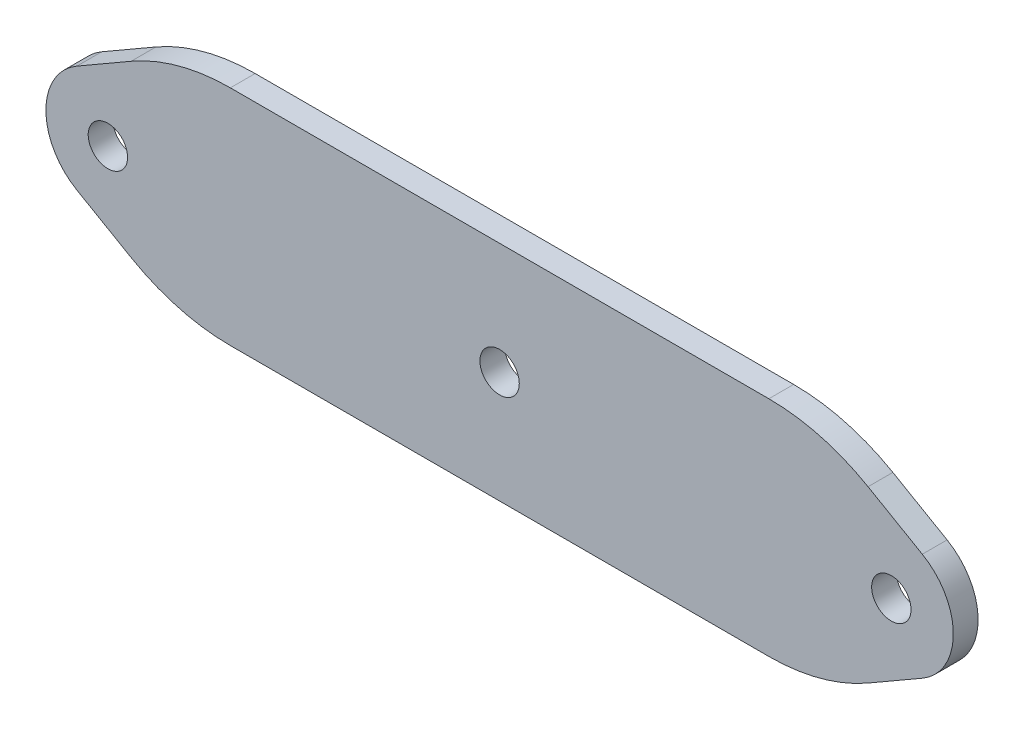
ISO-10303-21;
HEADER;
FILE_DESCRIPTION(('STEP AP214'),'2;1');
FILE_NAME('part.step','',(''),(''),'','','');
FILE_SCHEMA(('AUTOMOTIVE_DESIGN { 1 0 10303 214 1 1 1 1 }'));
ENDSEC;
DATA;
#1=APPLICATION_CONTEXT('core data for automotive mechanical design processes');
#2=APPLICATION_PROTOCOL_DEFINITION('international standard','automotive_design',2000,#1);
#3=PRODUCT_CONTEXT('',#1,'mechanical');
#4=PRODUCT('Part','Part','',(#3));
#5=PRODUCT_RELATED_PRODUCT_CATEGORY('part','',(#4));
#6=PRODUCT_DEFINITION_FORMATION('','',#4);
#7=PRODUCT_DEFINITION_CONTEXT('part definition',#1,'design');
#8=PRODUCT_DEFINITION('design','',#6,#7);
#9=PRODUCT_DEFINITION_SHAPE('','',#8);
#10=(LENGTH_UNIT() NAMED_UNIT(*) SI_UNIT(.MILLI.,.METRE.));
#11=(NAMED_UNIT(*) PLANE_ANGLE_UNIT() SI_UNIT($,.RADIAN.));
#12=(NAMED_UNIT(*) SI_UNIT($,.STERADIAN.) SOLID_ANGLE_UNIT());
#13=UNCERTAINTY_MEASURE_WITH_UNIT(LENGTH_MEASURE(1.E-05),#10,'distance_accuracy_value','');
#14=(GEOMETRIC_REPRESENTATION_CONTEXT(3) GLOBAL_UNCERTAINTY_ASSIGNED_CONTEXT((#13)) GLOBAL_UNIT_ASSIGNED_CONTEXT((#10,
#11,#12)) REPRESENTATION_CONTEXT('',''));
#15=CARTESIAN_POINT('',(0.,0.,0.));
#16=DIRECTION('',(0.,0.,1.));
#17=DIRECTION('',(1.,0.,0.));
#18=AXIS2_PLACEMENT_3D('',#15,#16,#17);
#19=CARTESIAN_POINT('',(78.9711431702999,0.,5.));
#20=DIRECTION('',(0.,0.,1.));
#21=DIRECTION('',(1.,0.,0.));
#22=AXIS2_PLACEMENT_3D('',#19,#20,#21);
#23=PLANE('',#22);
#24=CARTESIAN_POINT('',(78.9711431702999,0.,5.));
#25=DIRECTION('',(0.,0.,1.));
#26=DIRECTION('',(1.,0.,0.));
#27=AXIS2_PLACEMENT_3D('',#24,#25,#26);
#28=CIRCLE('',#27,3.96875);
#29=CARTESIAN_POINT('',(82.9398931702999,0.,5.));
#30=VERTEX_POINT('',#29);
#31=EDGE_CURVE('E333',#30,#30,#28,.T.);
#32=ORIENTED_EDGE('',*,*,#31,.F.);
#33=EDGE_LOOP('',(#32));
#34=FACE_BOUND('',#33,.T.);
#35=CARTESIAN_POINT('',(78.9711431702999,0.,5.));
#36=DIRECTION('',(0.,0.,1.));
#37=DIRECTION('',(1.,0.,0.));
#38=AXIS2_PLACEMENT_3D('',#35,#36,#37);
#39=CIRCLE('',#38,12.5);
#40=CARTESIAN_POINT('',(85.2211431702997,-10.8253175473056,5.));
#41=VERTEX_POINT('',#40);
#42=CARTESIAN_POINT('',(85.2211431702997,10.8253175473056,5.));
#43=VERTEX_POINT('',#42);
#44=EDGE_CURVE('E206',#41,#43,#39,.T.);
#45=ORIENTED_EDGE('',*,*,#44,.T.);
#46=DIRECTION('',(-0.86602540378444,0.499999999999998,0.));
#47=VECTOR('',#46,1.);
#48=CARTESIAN_POINT('',(74.2820323027552,17.1410161513775,5.));
#49=LINE('',#48,#47);
#50=CARTESIAN_POINT('',(74.2820323027552,17.1410161513775,5.));
#51=VERTEX_POINT('',#50);
#52=EDGE_CURVE('E118',#43,#51,#49,.T.);
#53=ORIENTED_EDGE('',*,*,#52,.T.);
#54=CARTESIAN_POINT('',(54.2820323027552,-17.5,5.));
#55=DIRECTION('',(0.,0.,1.));
#56=DIRECTION('',(-1.,0.,0.));
#57=AXIS2_PLACEMENT_3D('',#54,#55,#56);
#58=CIRCLE('',#57,40.);
#59=CARTESIAN_POINT('',(54.282032302755,22.5,5.));
#60=VERTEX_POINT('',#59);
#61=EDGE_CURVE('E243',#51,#60,#58,.T.);
#62=ORIENTED_EDGE('',*,*,#61,.T.);
#63=DIRECTION('',(-1.,0.,0.));
#64=VECTOR('',#63,1.);
#65=CARTESIAN_POINT('',(-54.282032302755,22.5,5.));
#66=LINE('',#65,#64);
#67=CARTESIAN_POINT('',(-54.282032302755,22.5,5.));
#68=VERTEX_POINT('',#67);
#69=EDGE_CURVE('E263',#60,#68,#66,.T.);
#70=ORIENTED_EDGE('',*,*,#69,.T.);
#71=CARTESIAN_POINT('',(-54.282032302755,-17.5,5.));
#72=DIRECTION('',(0.,0.,1.));
#73=DIRECTION('',(-1.,0.,0.));
#74=AXIS2_PLACEMENT_3D('',#71,#72,#73);
#75=CIRCLE('',#74,40.);
#76=CARTESIAN_POINT('',(-74.2820323027551,17.1410161513775,5.));
#77=VERTEX_POINT('',#76);
#78=EDGE_CURVE('E259',#68,#77,#75,.T.);
#79=ORIENTED_EDGE('',*,*,#78,.T.);
#80=DIRECTION('',(-0.866025403784437,-0.500000000000002,0.));
#81=VECTOR('',#80,1.);
#82=CARTESIAN_POINT('',(-85.2211431702997,10.8253175473055,5.));
#83=LINE('',#82,#81);
#84=CARTESIAN_POINT('',(-85.2211431702997,10.8253175473055,5.));
#85=VERTEX_POINT('',#84);
#86=EDGE_CURVE('E262',#77,#85,#83,.T.);
#87=ORIENTED_EDGE('',*,*,#86,.T.);
#88=CARTESIAN_POINT('',(-78.9711431702996,0.,5.));
#89=DIRECTION('',(0.,0.,1.));
#90=DIRECTION('',(-1.,0.,0.));
#91=AXIS2_PLACEMENT_3D('',#88,#89,#90);
#92=CIRCLE('',#91,12.5);
#93=CARTESIAN_POINT('',(-85.2211431702997,-10.8253175473055,5.));
#94=VERTEX_POINT('',#93);
#95=EDGE_CURVE('E267',#85,#94,#92,.T.);
#96=ORIENTED_EDGE('',*,*,#95,.T.);
#97=DIRECTION('',(0.866025403784438,-0.5,0.));
#98=VECTOR('',#97,1.);
#99=CARTESIAN_POINT('',(-74.2820323027551,-17.1410161513775,5.));
#100=LINE('',#99,#98);
#101=CARTESIAN_POINT('',(-74.2820323027551,-17.1410161513775,5.));
#102=VERTEX_POINT('',#101);
#103=EDGE_CURVE('E274',#94,#102,#100,.T.);
#104=ORIENTED_EDGE('',*,*,#103,.T.);
#105=CARTESIAN_POINT('',(-54.282032302755,17.5,5.));
#106=DIRECTION('',(0.,0.,1.));
#107=DIRECTION('',(-1.,0.,0.));
#108=AXIS2_PLACEMENT_3D('',#105,#106,#107);
#109=CIRCLE('',#108,40.);
#110=CARTESIAN_POINT('',(-54.2820323027551,-22.5,5.));
#111=VERTEX_POINT('',#110);
#112=EDGE_CURVE('E149',#102,#111,#109,.T.);
#113=ORIENTED_EDGE('',*,*,#112,.T.);
#114=DIRECTION('',(1.,0.,0.));
#115=VECTOR('',#114,1.);
#116=CARTESIAN_POINT('',(54.282032302755,-22.5,5.));
#117=LINE('',#116,#115);
#118=CARTESIAN_POINT('',(54.282032302755,-22.5,5.));
#119=VERTEX_POINT('',#118);
#120=EDGE_CURVE('E143',#111,#119,#117,.T.);
#121=ORIENTED_EDGE('',*,*,#120,.T.);
#122=CARTESIAN_POINT('',(54.2820323027552,17.5,5.));
#123=DIRECTION('',(0.,0.,1.));
#124=DIRECTION('',(1.,0.,0.));
#125=AXIS2_PLACEMENT_3D('',#122,#123,#124);
#126=CIRCLE('',#125,40.);
#127=CARTESIAN_POINT('',(74.2820323027552,-17.1410161513775,5.));
#128=VERTEX_POINT('',#127);
#129=EDGE_CURVE('E147',#119,#128,#126,.T.);
#130=ORIENTED_EDGE('',*,*,#129,.T.);
#131=DIRECTION('',(0.86602540378444,0.499999999999998,0.));
#132=VECTOR('',#131,1.);
#133=CARTESIAN_POINT('',(85.2211431702997,-10.8253175473056,5.));
#134=LINE('',#133,#132);
#135=EDGE_CURVE('E63',#128,#41,#134,.T.);
#136=ORIENTED_EDGE('',*,*,#135,.T.);
#137=EDGE_LOOP('',(#45,#53,#62,#70,#79,#87,#96,#104,#113,#121,#130,#136));
#138=FACE_BOUND('',#137,.T.);
#139=CARTESIAN_POINT('',(-78.9711431702996,0.,5.));
#140=DIRECTION('',(0.,0.,1.));
#141=DIRECTION('',(1.,0.,0.));
#142=AXIS2_PLACEMENT_3D('',#139,#140,#141);
#143=CIRCLE('',#142,3.96875);
#144=CARTESIAN_POINT('',(-75.0023931702996,0.,5.));
#145=VERTEX_POINT('',#144);
#146=EDGE_CURVE('E176',#145,#145,#143,.T.);
#147=ORIENTED_EDGE('',*,*,#146,.F.);
#148=EDGE_LOOP('',(#147));
#149=FACE_BOUND('',#148,.T.);
#150=CARTESIAN_POINT('',(0.,0.,5.));
#151=DIRECTION('',(0.,0.,1.));
#152=DIRECTION('',(1.,0.,0.));
#153=AXIS2_PLACEMENT_3D('',#150,#151,#152);
#154=CIRCLE('',#153,3.96875);
#155=CARTESIAN_POINT('',(3.96875,0.,5.));
#156=VERTEX_POINT('',#155);
#157=EDGE_CURVE('E322',#156,#156,#154,.T.);
#158=ORIENTED_EDGE('',*,*,#157,.F.);
#159=EDGE_LOOP('',(#158));
#160=FACE_BOUND('',#159,.T.);
#161=ADVANCED_FACE('F45',(#34,#138,#149,#160),#23,.T.);
#162=CARTESIAN_POINT('',(78.9711431702999,0.,0.));
#163=DIRECTION('',(0.,0.,1.));
#164=DIRECTION('',(1.,0.,0.));
#165=AXIS2_PLACEMENT_3D('',#162,#163,#164);
#166=PLANE('',#165);
#167=CARTESIAN_POINT('',(78.9711431702999,0.,0.));
#168=DIRECTION('',(0.,0.,1.));
#169=DIRECTION('',(1.,0.,0.));
#170=AXIS2_PLACEMENT_3D('',#167,#168,#169);
#171=CIRCLE('',#170,12.5);
#172=CARTESIAN_POINT('',(85.2211431702997,-10.8253175473056,0.));
#173=VERTEX_POINT('',#172);
#174=CARTESIAN_POINT('',(85.2211431702997,10.8253175473056,0.));
#175=VERTEX_POINT('',#174);
#176=EDGE_CURVE('E171',#173,#175,#171,.T.);
#177=ORIENTED_EDGE('',*,*,#176,.F.);
#178=DIRECTION('',(0.86602540378444,0.499999999999998,0.));
#179=VECTOR('',#178,1.);
#180=CARTESIAN_POINT('',(85.2211431702997,-10.8253175473056,0.));
#181=LINE('',#180,#179);
#182=CARTESIAN_POINT('',(74.2820323027552,-17.1410161513775,0.));
#183=VERTEX_POINT('',#182);
#184=EDGE_CURVE('E110',#183,#173,#181,.T.);
#185=ORIENTED_EDGE('',*,*,#184,.F.);
#186=CARTESIAN_POINT('',(54.2820323027552,17.5,0.));
#187=DIRECTION('',(0.,0.,1.));
#188=DIRECTION('',(1.,0.,0.));
#189=AXIS2_PLACEMENT_3D('',#186,#187,#188);
#190=CIRCLE('',#189,40.);
#191=CARTESIAN_POINT('',(54.282032302755,-22.5,0.));
#192=VERTEX_POINT('',#191);
#193=EDGE_CURVE('E104',#192,#183,#190,.T.);
#194=ORIENTED_EDGE('',*,*,#193,.F.);
#195=DIRECTION('',(1.,0.,0.));
#196=VECTOR('',#195,1.);
#197=CARTESIAN_POINT('',(54.282032302755,-22.5,0.));
#198=LINE('',#197,#196);
#199=CARTESIAN_POINT('',(-54.2820323027551,-22.5,0.));
#200=VERTEX_POINT('',#199);
#201=EDGE_CURVE('E158',#200,#192,#198,.T.);
#202=ORIENTED_EDGE('',*,*,#201,.F.);
#203=CARTESIAN_POINT('',(-54.282032302755,17.5,0.));
#204=DIRECTION('',(0.,0.,1.));
#205=DIRECTION('',(-1.,0.,0.));
#206=AXIS2_PLACEMENT_3D('',#203,#204,#205);
#207=CIRCLE('',#206,40.);
#208=CARTESIAN_POINT('',(-74.2820323027551,-17.1410161513775,0.));
#209=VERTEX_POINT('',#208);
#210=EDGE_CURVE('E197',#209,#200,#207,.T.);
#211=ORIENTED_EDGE('',*,*,#210,.F.);
#212=DIRECTION('',(0.866025403784438,-0.5,0.));
#213=VECTOR('',#212,1.);
#214=CARTESIAN_POINT('',(-74.2820323027551,-17.1410161513775,0.));
#215=LINE('',#214,#213);
#216=CARTESIAN_POINT('',(-85.2211431702997,-10.8253175473055,0.));
#217=VERTEX_POINT('',#216);
#218=EDGE_CURVE('E194',#217,#209,#215,.T.);
#219=ORIENTED_EDGE('',*,*,#218,.F.);
#220=CARTESIAN_POINT('',(-78.9711431702996,0.,0.));
#221=DIRECTION('',(0.,0.,1.));
#222=DIRECTION('',(-1.,0.,0.));
#223=AXIS2_PLACEMENT_3D('',#220,#221,#222);
#224=CIRCLE('',#223,12.5);
#225=CARTESIAN_POINT('',(-85.2211431702997,10.8253175473055,0.));
#226=VERTEX_POINT('',#225);
#227=EDGE_CURVE('E191',#226,#217,#224,.T.);
#228=ORIENTED_EDGE('',*,*,#227,.F.);
#229=DIRECTION('',(-0.866025403784437,-0.500000000000002,0.));
#230=VECTOR('',#229,1.);
#231=CARTESIAN_POINT('',(-85.2211431702997,10.8253175473055,0.));
#232=LINE('',#231,#230);
#233=CARTESIAN_POINT('',(-74.2820323027551,17.1410161513775,0.));
#234=VERTEX_POINT('',#233);
#235=EDGE_CURVE('E188',#234,#226,#232,.T.);
#236=ORIENTED_EDGE('',*,*,#235,.F.);
#237=CARTESIAN_POINT('',(-54.282032302755,-17.5,0.));
#238=DIRECTION('',(0.,0.,1.));
#239=DIRECTION('',(-1.,0.,0.));
#240=AXIS2_PLACEMENT_3D('',#237,#238,#239);
#241=CIRCLE('',#240,40.);
#242=CARTESIAN_POINT('',(-54.282032302755,22.5,0.));
#243=VERTEX_POINT('',#242);
#244=EDGE_CURVE('E185',#243,#234,#241,.T.);
#245=ORIENTED_EDGE('',*,*,#244,.F.);
#246=DIRECTION('',(-1.,0.,0.));
#247=VECTOR('',#246,1.);
#248=CARTESIAN_POINT('',(-54.282032302755,22.5,0.));
#249=LINE('',#248,#247);
#250=CARTESIAN_POINT('',(54.282032302755,22.5,0.));
#251=VERTEX_POINT('',#250);
#252=EDGE_CURVE('E182',#251,#243,#249,.T.);
#253=ORIENTED_EDGE('',*,*,#252,.F.);
#254=CARTESIAN_POINT('',(54.2820323027552,-17.5,0.));
#255=DIRECTION('',(0.,0.,1.));
#256=DIRECTION('',(-1.,0.,0.));
#257=AXIS2_PLACEMENT_3D('',#254,#255,#256);
#258=CIRCLE('',#257,40.);
#259=CARTESIAN_POINT('',(74.2820323027552,17.1410161513775,0.));
#260=VERTEX_POINT('',#259);
#261=EDGE_CURVE('E179',#260,#251,#258,.T.);
#262=ORIENTED_EDGE('',*,*,#261,.F.);
#263=DIRECTION('',(-0.86602540378444,0.499999999999998,0.));
#264=VECTOR('',#263,1.);
#265=CARTESIAN_POINT('',(74.2820323027552,17.1410161513775,0.));
#266=LINE('',#265,#264);
#267=EDGE_CURVE('E175',#175,#260,#266,.T.);
#268=ORIENTED_EDGE('',*,*,#267,.F.);
#269=EDGE_LOOP('',(#177,#185,#194,#202,#211,#219,#228,#236,#245,#253,#262,#268));
#270=FACE_BOUND('',#269,.T.);
#271=CARTESIAN_POINT('',(-78.9711431702996,0.,0.));
#272=DIRECTION('',(0.,0.,1.));
#273=DIRECTION('',(1.,0.,0.));
#274=AXIS2_PLACEMENT_3D('',#271,#272,#273);
#275=CIRCLE('',#274,3.96875);
#276=CARTESIAN_POINT('',(-75.0023931702996,0.,0.));
#277=VERTEX_POINT('',#276);
#278=EDGE_CURVE('E337',#277,#277,#275,.T.);
#279=ORIENTED_EDGE('',*,*,#278,.T.);
#280=EDGE_LOOP('',(#279));
#281=FACE_BOUND('',#280,.T.);
#282=CARTESIAN_POINT('',(78.9711431702999,0.,0.));
#283=DIRECTION('',(0.,0.,1.));
#284=DIRECTION('',(1.,0.,0.));
#285=AXIS2_PLACEMENT_3D('',#282,#283,#284);
#286=CIRCLE('',#285,3.96875);
#287=CARTESIAN_POINT('',(82.9398931702999,0.,0.));
#288=VERTEX_POINT('',#287);
#289=EDGE_CURVE('E330',#288,#288,#286,.T.);
#290=ORIENTED_EDGE('',*,*,#289,.T.);
#291=EDGE_LOOP('',(#290));
#292=FACE_BOUND('',#291,.T.);
#293=CARTESIAN_POINT('',(0.,0.,0.));
#294=DIRECTION('',(0.,0.,1.));
#295=DIRECTION('',(1.,0.,0.));
#296=AXIS2_PLACEMENT_3D('',#293,#294,#295);
#297=CIRCLE('',#296,3.96875);
#298=CARTESIAN_POINT('',(3.96875,0.,0.));
#299=VERTEX_POINT('',#298);
#300=EDGE_CURVE('E325',#299,#299,#297,.T.);
#301=ORIENTED_EDGE('',*,*,#300,.T.);
#302=EDGE_LOOP('',(#301));
#303=FACE_BOUND('',#302,.T.);
#304=ADVANCED_FACE('F247',(#270,#281,#292,#303),#166,.F.);
#305=CARTESIAN_POINT('',(78.9711431702999,0.,5.));
#306=DIRECTION('',(0.,0.,-1.));
#307=DIRECTION('',(-1.,0.,0.));
#308=AXIS2_PLACEMENT_3D('',#305,#306,#307);
#309=CYLINDRICAL_SURFACE('',#308,12.5);
#310=ORIENTED_EDGE('',*,*,#176,.T.);
#311=DIRECTION('',(0.,0.,-1.));
#312=VECTOR('',#311,1.);
#313=CARTESIAN_POINT('',(85.2211431702997,10.8253175473056,5.));
#314=LINE('',#313,#312);
#315=EDGE_CURVE('E11',#43,#175,#314,.T.);
#316=ORIENTED_EDGE('',*,*,#315,.F.);
#317=ORIENTED_EDGE('',*,*,#44,.F.);
#318=DIRECTION('',(0.,0.,-1.));
#319=VECTOR('',#318,1.);
#320=CARTESIAN_POINT('',(85.2211431702997,-10.8253175473056,5.));
#321=LINE('',#320,#319);
#322=EDGE_CURVE('E167',#41,#173,#321,.T.);
#323=ORIENTED_EDGE('',*,*,#322,.T.);
#324=EDGE_LOOP('',(#310,#316,#317,#323));
#325=FACE_BOUND('',#324,.T.);
#326=ADVANCED_FACE('F47',(#325),#309,.T.);
#327=CARTESIAN_POINT('',(74.2820323027552,17.1410161513775,5.));
#328=DIRECTION('',(-0.499999999999998,-0.86602540378444,0.));
#329=DIRECTION('',(0.86602540378444,-0.499999999999998,0.));
#330=AXIS2_PLACEMENT_3D('',#327,#328,#329);
#331=PLANE('',#330);
#332=ORIENTED_EDGE('',*,*,#267,.T.);
#333=DIRECTION('',(0.,0.,-1.));
#334=VECTOR('',#333,1.);
#335=CARTESIAN_POINT('',(74.2820323027552,17.1410161513775,5.));
#336=LINE('',#335,#334);
#337=EDGE_CURVE('E55',#51,#260,#336,.T.);
#338=ORIENTED_EDGE('',*,*,#337,.F.);
#339=ORIENTED_EDGE('',*,*,#52,.F.);
#340=ORIENTED_EDGE('',*,*,#315,.T.);
#341=EDGE_LOOP('',(#332,#338,#339,#340));
#342=FACE_BOUND('',#341,.T.);
#343=ADVANCED_FACE('F455',(#342),#331,.F.);
#344=CARTESIAN_POINT('',(54.2820323027552,-17.5,5.));
#345=DIRECTION('',(0.,0.,-1.));
#346=DIRECTION('',(-1.,0.,0.));
#347=AXIS2_PLACEMENT_3D('',#344,#345,#346);
#348=CYLINDRICAL_SURFACE('',#347,40.);
#349=ORIENTED_EDGE('',*,*,#261,.T.);
#350=DIRECTION('',(0.,0.,-1.));
#351=VECTOR('',#350,1.);
#352=CARTESIAN_POINT('',(54.282032302755,22.5,5.));
#353=LINE('',#352,#351);
#354=EDGE_CURVE('E233',#60,#251,#353,.T.);
#355=ORIENTED_EDGE('',*,*,#354,.F.);
#356=ORIENTED_EDGE('',*,*,#61,.F.);
#357=ORIENTED_EDGE('',*,*,#337,.T.);
#358=EDGE_LOOP('',(#349,#355,#356,#357));
#359=FACE_BOUND('',#358,.T.);
#360=ADVANCED_FACE('F241',(#359),#348,.T.);
#361=CARTESIAN_POINT('',(-54.282032302755,22.5,5.));
#362=DIRECTION('',(0.,-1.,0.));
#363=DIRECTION('',(0.,0.,-1.));
#364=AXIS2_PLACEMENT_3D('',#361,#362,#363);
#365=PLANE('',#364);
#366=ORIENTED_EDGE('',*,*,#252,.T.);
#367=DIRECTION('',(0.,0.,-1.));
#368=VECTOR('',#367,1.);
#369=CARTESIAN_POINT('',(-54.282032302755,22.5,5.));
#370=LINE('',#369,#368);
#371=EDGE_CURVE('E229',#68,#243,#370,.T.);
#372=ORIENTED_EDGE('',*,*,#371,.F.);
#373=ORIENTED_EDGE('',*,*,#69,.F.);
#374=ORIENTED_EDGE('',*,*,#354,.T.);
#375=EDGE_LOOP('',(#366,#372,#373,#374));
#376=FACE_BOUND('',#375,.T.);
#377=ADVANCED_FACE('F253',(#376),#365,.F.);
#378=CARTESIAN_POINT('',(-54.282032302755,-17.5,5.));
#379=DIRECTION('',(0.,0.,-1.));
#380=DIRECTION('',(-1.,0.,0.));
#381=AXIS2_PLACEMENT_3D('',#378,#379,#380);
#382=CYLINDRICAL_SURFACE('',#381,40.);
#383=ORIENTED_EDGE('',*,*,#244,.T.);
#384=DIRECTION('',(0.,0.,-1.));
#385=VECTOR('',#384,1.);
#386=CARTESIAN_POINT('',(-74.2820323027551,17.1410161513775,5.));
#387=LINE('',#386,#385);
#388=EDGE_CURVE('E225',#77,#234,#387,.T.);
#389=ORIENTED_EDGE('',*,*,#388,.F.);
#390=ORIENTED_EDGE('',*,*,#78,.F.);
#391=ORIENTED_EDGE('',*,*,#371,.T.);
#392=EDGE_LOOP('',(#383,#389,#390,#391));
#393=FACE_BOUND('',#392,.T.);
#394=ADVANCED_FACE('F257',(#393),#382,.T.);
#395=CARTESIAN_POINT('',(-85.2211431702997,10.8253175473055,5.));
#396=DIRECTION('',(0.500000000000003,-0.866025403784437,0.));
#397=DIRECTION('',(0.866025403784437,0.500000000000003,0.));
#398=AXIS2_PLACEMENT_3D('',#395,#396,#397);
#399=PLANE('',#398);
#400=ORIENTED_EDGE('',*,*,#235,.T.);
#401=DIRECTION('',(0.,0.,-1.));
#402=VECTOR('',#401,1.);
#403=CARTESIAN_POINT('',(-85.2211431702997,10.8253175473055,5.));
#404=LINE('',#403,#402);
#405=EDGE_CURVE('E221',#85,#226,#404,.T.);
#406=ORIENTED_EDGE('',*,*,#405,.F.);
#407=ORIENTED_EDGE('',*,*,#86,.F.);
#408=ORIENTED_EDGE('',*,*,#388,.T.);
#409=EDGE_LOOP('',(#400,#406,#407,#408));
#410=FACE_BOUND('',#409,.T.);
#411=ADVANCED_FACE('F416',(#410),#399,.F.);
#412=CARTESIAN_POINT('',(-78.9711431702996,0.,5.));
#413=DIRECTION('',(0.,0.,-1.));
#414=DIRECTION('',(-1.,0.,0.));
#415=AXIS2_PLACEMENT_3D('',#412,#413,#414);
#416=CYLINDRICAL_SURFACE('',#415,12.5);
#417=ORIENTED_EDGE('',*,*,#227,.T.);
#418=DIRECTION('',(0.,0.,-1.));
#419=VECTOR('',#418,1.);
#420=CARTESIAN_POINT('',(-85.2211431702997,-10.8253175473055,5.));
#421=LINE('',#420,#419);
#422=EDGE_CURVE('E217',#94,#217,#421,.T.);
#423=ORIENTED_EDGE('',*,*,#422,.F.);
#424=ORIENTED_EDGE('',*,*,#95,.F.);
#425=ORIENTED_EDGE('',*,*,#405,.T.);
#426=EDGE_LOOP('',(#417,#423,#424,#425));
#427=FACE_BOUND('',#426,.T.);
#428=ADVANCED_FACE('F406',(#427),#416,.T.);
#429=CARTESIAN_POINT('',(-74.2820323027551,-17.1410161513775,5.));
#430=DIRECTION('',(0.5,0.866025403784438,0.));
#431=DIRECTION('',(-0.866025403784438,0.5,0.));
#432=AXIS2_PLACEMENT_3D('',#429,#430,#431);
#433=PLANE('',#432);
#434=ORIENTED_EDGE('',*,*,#218,.T.);
#435=DIRECTION('',(0.,0.,-1.));
#436=VECTOR('',#435,1.);
#437=CARTESIAN_POINT('',(-74.2820323027551,-17.1410161513775,5.));
#438=LINE('',#437,#436);
#439=EDGE_CURVE('E213',#102,#209,#438,.T.);
#440=ORIENTED_EDGE('',*,*,#439,.F.);
#441=ORIENTED_EDGE('',*,*,#103,.F.);
#442=ORIENTED_EDGE('',*,*,#422,.T.);
#443=EDGE_LOOP('',(#434,#440,#441,#442));
#444=FACE_BOUND('',#443,.T.);
#445=ADVANCED_FACE('F282',(#444),#433,.F.);
#446=CARTESIAN_POINT('',(-54.282032302755,17.5,5.));
#447=DIRECTION('',(0.,0.,-1.));
#448=DIRECTION('',(-1.,0.,0.));
#449=AXIS2_PLACEMENT_3D('',#446,#447,#448);
#450=CYLINDRICAL_SURFACE('',#449,40.);
#451=ORIENTED_EDGE('',*,*,#210,.T.);
#452=DIRECTION('',(0.,0.,-1.));
#453=VECTOR('',#452,1.);
#454=CARTESIAN_POINT('',(-54.2820323027551,-22.5,5.));
#455=LINE('',#454,#453);
#456=EDGE_CURVE('E160',#111,#200,#455,.T.);
#457=ORIENTED_EDGE('',*,*,#456,.F.);
#458=ORIENTED_EDGE('',*,*,#112,.F.);
#459=ORIENTED_EDGE('',*,*,#439,.T.);
#460=EDGE_LOOP('',(#451,#457,#458,#459));
#461=FACE_BOUND('',#460,.T.);
#462=ADVANCED_FACE('F286',(#461),#450,.T.);
#463=CARTESIAN_POINT('',(54.282032302755,-22.5,5.));
#464=DIRECTION('',(0.,1.,0.));
#465=DIRECTION('',(0.,0.,1.));
#466=AXIS2_PLACEMENT_3D('',#463,#464,#465);
#467=PLANE('',#466);
#468=ORIENTED_EDGE('',*,*,#201,.T.);
#469=DIRECTION('',(0.,0.,-1.));
#470=VECTOR('',#469,1.);
#471=CARTESIAN_POINT('',(54.282032302755,-22.5,5.));
#472=LINE('',#471,#470);
#473=EDGE_CURVE('E155',#119,#192,#472,.T.);
#474=ORIENTED_EDGE('',*,*,#473,.F.);
#475=ORIENTED_EDGE('',*,*,#120,.F.);
#476=ORIENTED_EDGE('',*,*,#456,.T.);
#477=EDGE_LOOP('',(#468,#474,#475,#476));
#478=FACE_BOUND('',#477,.T.);
#479=ADVANCED_FACE('F156',(#478),#467,.F.);
#480=CARTESIAN_POINT('',(54.2820323027552,17.5,5.));
#481=DIRECTION('',(0.,0.,-1.));
#482=DIRECTION('',(-1.,0.,0.));
#483=AXIS2_PLACEMENT_3D('',#480,#481,#482);
#484=CYLINDRICAL_SURFACE('',#483,40.);
#485=ORIENTED_EDGE('',*,*,#193,.T.);
#486=DIRECTION('',(0.,0.,-1.));
#487=VECTOR('',#486,1.);
#488=CARTESIAN_POINT('',(74.2820323027552,-17.1410161513775,5.));
#489=LINE('',#488,#487);
#490=EDGE_CURVE('E161',#128,#183,#489,.T.);
#491=ORIENTED_EDGE('',*,*,#490,.F.);
#492=ORIENTED_EDGE('',*,*,#129,.F.);
#493=ORIENTED_EDGE('',*,*,#473,.T.);
#494=EDGE_LOOP('',(#485,#491,#492,#493));
#495=FACE_BOUND('',#494,.T.);
#496=ADVANCED_FACE('F163',(#495),#484,.T.);
#497=CARTESIAN_POINT('',(85.2211431702997,-10.8253175473056,5.));
#498=DIRECTION('',(-0.499999999999998,0.86602540378444,0.));
#499=DIRECTION('',(-0.86602540378444,-0.499999999999998,0.));
#500=AXIS2_PLACEMENT_3D('',#497,#498,#499);
#501=PLANE('',#500);
#502=ORIENTED_EDGE('',*,*,#184,.T.);
#503=ORIENTED_EDGE('',*,*,#322,.F.);
#504=ORIENTED_EDGE('',*,*,#135,.F.);
#505=ORIENTED_EDGE('',*,*,#490,.T.);
#506=EDGE_LOOP('',(#502,#503,#504,#505));
#507=FACE_BOUND('',#506,.T.);
#508=ADVANCED_FACE('F290',(#507),#501,.F.);
#509=CARTESIAN_POINT('',(-78.9711431702996,0.,5.));
#510=DIRECTION('',(0.,0.,-1.));
#511=DIRECTION('',(-1.,0.,0.));
#512=AXIS2_PLACEMENT_3D('',#509,#510,#511);
#513=CYLINDRICAL_SURFACE('',#512,3.96875);
#514=ORIENTED_EDGE('',*,*,#146,.T.);
#515=EDGE_LOOP('',(#514));
#516=FACE_BOUND('',#515,.T.);
#517=ORIENTED_EDGE('',*,*,#278,.F.);
#518=EDGE_LOOP('',(#517));
#519=FACE_BOUND('',#518,.T.);
#520=ADVANCED_FACE('F292',(#516,#519),#513,.F.);
#521=CARTESIAN_POINT('',(78.9711431702999,0.,5.));
#522=DIRECTION('',(0.,0.,-1.));
#523=DIRECTION('',(-1.,0.,0.));
#524=AXIS2_PLACEMENT_3D('',#521,#522,#523);
#525=CYLINDRICAL_SURFACE('',#524,3.96875);
#526=ORIENTED_EDGE('',*,*,#31,.T.);
#527=EDGE_LOOP('',(#526));
#528=FACE_BOUND('',#527,.T.);
#529=ORIENTED_EDGE('',*,*,#289,.F.);
#530=EDGE_LOOP('',(#529));
#531=FACE_BOUND('',#530,.T.);
#532=ADVANCED_FACE('F298',(#528,#531),#525,.F.);
#533=CARTESIAN_POINT('',(0.,0.,5.));
#534=DIRECTION('',(0.,0.,-1.));
#535=DIRECTION('',(-1.,0.,0.));
#536=AXIS2_PLACEMENT_3D('',#533,#534,#535);
#537=CYLINDRICAL_SURFACE('',#536,3.96875);
#538=ORIENTED_EDGE('',*,*,#157,.T.);
#539=EDGE_LOOP('',(#538));
#540=FACE_BOUND('',#539,.T.);
#541=ORIENTED_EDGE('',*,*,#300,.F.);
#542=EDGE_LOOP('',(#541));
#543=FACE_BOUND('',#542,.T.);
#544=ADVANCED_FACE('F313',(#540,#543),#537,.F.);
#545=CLOSED_SHELL('',(#161,#304,#326,#343,#360,#377,#394,#411,#428,#445,#462,#479,#496,#508,
#520,#532,#544));
#546=MANIFOLD_SOLID_BREP('B2',#545);
#547=ADVANCED_BREP_SHAPE_REPRESENTATION('',(#18,#546),#14);
#548=SHAPE_DEFINITION_REPRESENTATION(#9,#547);
ENDSEC;
END-ISO-10303-21;
